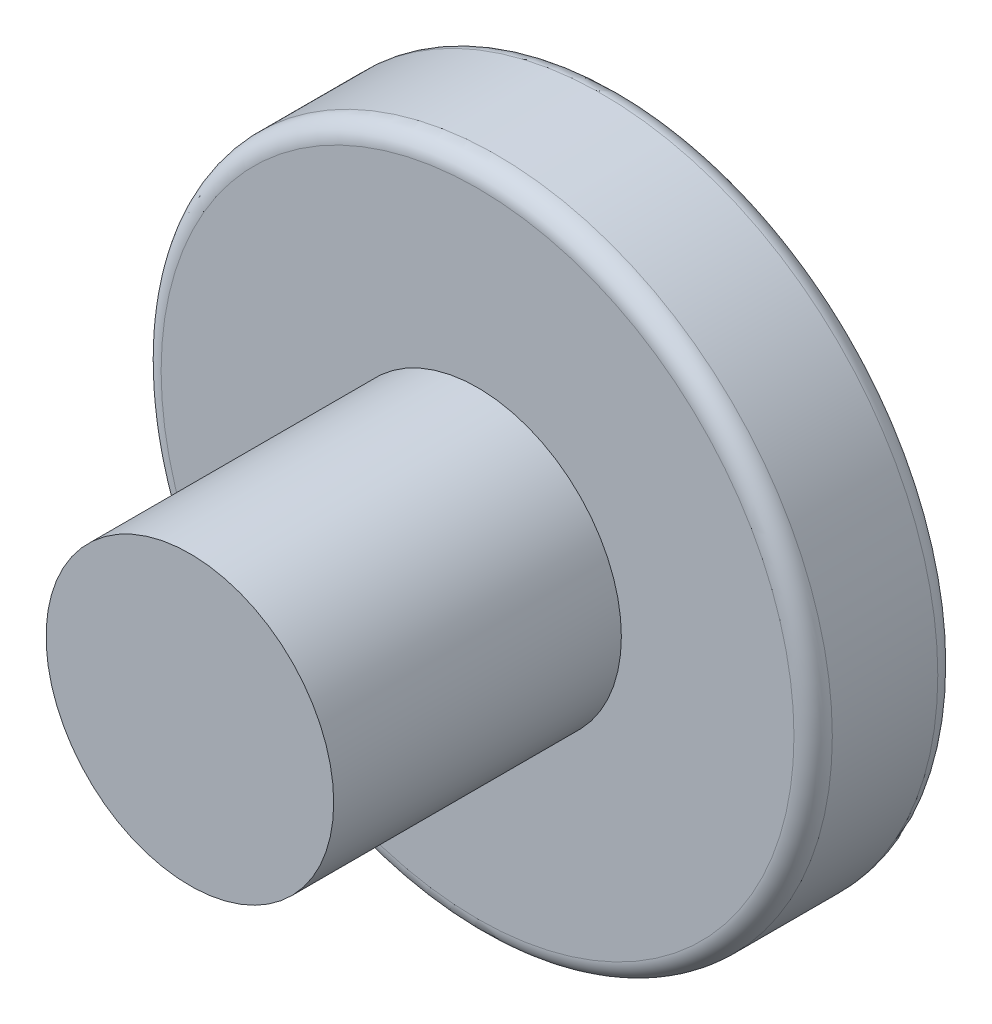
ISO-10303-21;
HEADER;
FILE_DESCRIPTION(('STEP AP214'),'2;1');
FILE_NAME('part.step','',(''),(''),'','','');
FILE_SCHEMA(('AUTOMOTIVE_DESIGN { 1 0 10303 214 1 1 1 1 }'));
ENDSEC;
DATA;
#1=APPLICATION_CONTEXT('core data for automotive mechanical design processes');
#2=APPLICATION_PROTOCOL_DEFINITION('international standard','automotive_design',2000,#1);
#3=PRODUCT_CONTEXT('',#1,'mechanical');
#4=PRODUCT('Part','Part','',(#3));
#5=PRODUCT_RELATED_PRODUCT_CATEGORY('part','',(#4));
#6=PRODUCT_DEFINITION_FORMATION('','',#4);
#7=PRODUCT_DEFINITION_CONTEXT('part definition',#1,'design');
#8=PRODUCT_DEFINITION('design','',#6,#7);
#9=PRODUCT_DEFINITION_SHAPE('','',#8);
#10=(LENGTH_UNIT() NAMED_UNIT(*) SI_UNIT(.MILLI.,.METRE.));
#11=(NAMED_UNIT(*) PLANE_ANGLE_UNIT() SI_UNIT($,.RADIAN.));
#12=(NAMED_UNIT(*) SI_UNIT($,.STERADIAN.) SOLID_ANGLE_UNIT());
#13=UNCERTAINTY_MEASURE_WITH_UNIT(LENGTH_MEASURE(1.E-05),#10,'distance_accuracy_value','');
#14=(GEOMETRIC_REPRESENTATION_CONTEXT(3) GLOBAL_UNCERTAINTY_ASSIGNED_CONTEXT((#13)) GLOBAL_UNIT_ASSIGNED_CONTEXT((#10,
#11,#12)) REPRESENTATION_CONTEXT('',''));
#15=CARTESIAN_POINT('',(0.,0.,0.));
#16=DIRECTION('',(0.,0.,1.));
#17=DIRECTION('',(1.,0.,0.));
#18=AXIS2_PLACEMENT_3D('',#15,#16,#17);
#19=CARTESIAN_POINT('',(0.,0.,1.5));
#20=DIRECTION('',(0.,0.,-1.));
#21=DIRECTION('',(-1.,0.,0.));
#22=AXIS2_PLACEMENT_3D('',#19,#20,#21);
#23=CYLINDRICAL_SURFACE('',#22,3.5);
#24=CARTESIAN_POINT('',(0.,0.,0.2));
#25=DIRECTION('',(0.,0.,1.));
#26=DIRECTION('',(1.,0.,0.));
#27=AXIS2_PLACEMENT_3D('',#24,#25,#26);
#28=CIRCLE('',#27,3.5);
#29=CARTESIAN_POINT('',(3.5,0.,0.2));
#30=VERTEX_POINT('',#29);
#31=EDGE_CURVE('E154',#30,#30,#28,.T.);
#32=ORIENTED_EDGE('',*,*,#31,.T.);
#33=EDGE_LOOP('',(#32));
#34=FACE_BOUND('',#33,.T.);
#35=CARTESIAN_POINT('',(0.,0.,1.3));
#36=DIRECTION('',(0.,0.,1.));
#37=DIRECTION('',(1.,0.,0.));
#38=AXIS2_PLACEMENT_3D('',#35,#36,#37);
#39=CIRCLE('',#38,3.5);
#40=CARTESIAN_POINT('',(3.5,0.,1.3));
#41=VERTEX_POINT('',#40);
#42=EDGE_CURVE('E151',#41,#41,#39,.F.);
#43=ORIENTED_EDGE('',*,*,#42,.T.);
#44=EDGE_LOOP('',(#43));
#45=FACE_BOUND('',#44,.T.);
#46=ADVANCED_FACE('F38',(#34,#45),#23,.T.);
#47=CARTESIAN_POINT('',(0.,0.,1.5));
#48=DIRECTION('',(0.,0.,1.));
#49=DIRECTION('',(1.,0.,0.));
#50=AXIS2_PLACEMENT_3D('',#47,#48,#49);
#51=PLANE('',#50);
#52=CARTESIAN_POINT('',(0.,0.,1.5));
#53=DIRECTION('',(0.,0.,1.));
#54=DIRECTION('',(1.,0.,0.));
#55=AXIS2_PLACEMENT_3D('',#52,#53,#54);
#56=CIRCLE('',#55,3.3);
#57=CARTESIAN_POINT('',(3.3,0.,1.5));
#58=VERTEX_POINT('',#57);
#59=EDGE_CURVE('E11',#58,#58,#56,.T.);
#60=ORIENTED_EDGE('',*,*,#59,.T.);
#61=EDGE_LOOP('',(#60));
#62=FACE_BOUND('',#61,.T.);
#63=CARTESIAN_POINT('',(0.,0.,1.5));
#64=DIRECTION('',(0.,0.,1.));
#65=DIRECTION('',(1.,0.,0.));
#66=AXIS2_PLACEMENT_3D('',#63,#64,#65);
#67=CIRCLE('',#66,1.5);
#68=CARTESIAN_POINT('',(1.5,0.,1.5));
#69=VERTEX_POINT('',#68);
#70=EDGE_CURVE('E148',#69,#69,#67,.T.);
#71=ORIENTED_EDGE('',*,*,#70,.F.);
#72=EDGE_LOOP('',(#71));
#73=FACE_BOUND('',#72,.T.);
#74=ADVANCED_FACE('F169',(#62,#73),#51,.T.);
#75=CARTESIAN_POINT('',(0.,0.,0.));
#76=DIRECTION('',(0.,0.,1.));
#77=DIRECTION('',(1.,0.,0.));
#78=AXIS2_PLACEMENT_3D('',#75,#76,#77);
#79=PLANE('',#78);
#80=DIRECTION('',(0.5,0.866025403784438,0.));
#81=VECTOR('',#80,1.);
#82=CARTESIAN_POINT('',(-1.15470053837925,0.,0.));
#83=LINE('',#82,#81);
#84=CARTESIAN_POINT('',(-1.15470053837925,0.,0.));
#85=VERTEX_POINT('',#84);
#86=CARTESIAN_POINT('',(-0.577350269189626,1.,0.));
#87=VERTEX_POINT('',#86);
#88=EDGE_CURVE('E127',#85,#87,#83,.T.);
#89=ORIENTED_EDGE('',*,*,#88,.F.);
#90=DIRECTION('',(-0.5,0.866025403784439,0.));
#91=VECTOR('',#90,1.);
#92=CARTESIAN_POINT('',(-0.577350269189626,-1.,0.));
#93=LINE('',#92,#91);
#94=CARTESIAN_POINT('',(-0.577350269189626,-1.,0.));
#95=VERTEX_POINT('',#94);
#96=EDGE_CURVE('E53',#95,#85,#93,.T.);
#97=ORIENTED_EDGE('',*,*,#96,.F.);
#98=DIRECTION('',(-1.,0.,0.));
#99=VECTOR('',#98,1.);
#100=CARTESIAN_POINT('',(0.577350269189626,-1.,0.));
#101=LINE('',#100,#99);
#102=CARTESIAN_POINT('',(0.577350269189626,-1.,0.));
#103=VERTEX_POINT('',#102);
#104=EDGE_CURVE('E136',#103,#95,#101,.T.);
#105=ORIENTED_EDGE('',*,*,#104,.F.);
#106=DIRECTION('',(-0.5,-0.866025403784438,0.));
#107=VECTOR('',#106,1.);
#108=CARTESIAN_POINT('',(1.15470053837925,0.,0.));
#109=LINE('',#108,#107);
#110=CARTESIAN_POINT('',(1.15470053837925,0.,0.));
#111=VERTEX_POINT('',#110);
#112=EDGE_CURVE('E134',#111,#103,#109,.T.);
#113=ORIENTED_EDGE('',*,*,#112,.F.);
#114=DIRECTION('',(0.5,-0.866025403784439,0.));
#115=VECTOR('',#114,1.);
#116=CARTESIAN_POINT('',(0.577350269189626,1.,0.));
#117=LINE('',#116,#115);
#118=CARTESIAN_POINT('',(0.577350269189626,1.,0.));
#119=VERTEX_POINT('',#118);
#120=EDGE_CURVE('E101',#119,#111,#117,.T.);
#121=ORIENTED_EDGE('',*,*,#120,.F.);
#122=DIRECTION('',(1.,0.,0.));
#123=VECTOR('',#122,1.);
#124=CARTESIAN_POINT('',(-0.577350269189626,1.,0.));
#125=LINE('',#124,#123);
#126=EDGE_CURVE('E130',#87,#119,#125,.T.);
#127=ORIENTED_EDGE('',*,*,#126,.F.);
#128=EDGE_LOOP('',(#89,#97,#105,#113,#121,#127));
#129=FACE_BOUND('',#128,.T.);
#130=CARTESIAN_POINT('',(0.,0.,0.));
#131=DIRECTION('',(0.,0.,1.));
#132=DIRECTION('',(1.,0.,0.));
#133=AXIS2_PLACEMENT_3D('',#130,#131,#132);
#134=CIRCLE('',#133,3.3);
#135=CARTESIAN_POINT('',(3.3,0.,0.));
#136=VERTEX_POINT('',#135);
#137=EDGE_CURVE('E46',#136,#136,#134,.F.);
#138=ORIENTED_EDGE('',*,*,#137,.T.);
#139=EDGE_LOOP('',(#138));
#140=FACE_BOUND('',#139,.T.);
#141=ADVANCED_FACE('F159',(#129,#140),#79,.F.);
#142=CARTESIAN_POINT('',(0.,0.,4.5));
#143=DIRECTION('',(0.,0.,-1.));
#144=DIRECTION('',(-1.,0.,0.));
#145=AXIS2_PLACEMENT_3D('',#142,#143,#144);
#146=CYLINDRICAL_SURFACE('',#145,1.5);
#147=CARTESIAN_POINT('',(0.,0.,4.5));
#148=DIRECTION('',(0.,0.,1.));
#149=DIRECTION('',(1.,0.,0.));
#150=AXIS2_PLACEMENT_3D('',#147,#148,#149);
#151=CIRCLE('',#150,1.5);
#152=CARTESIAN_POINT('',(1.5,0.,4.5));
#153=VERTEX_POINT('',#152);
#154=EDGE_CURVE('E140',#153,#153,#151,.T.);
#155=ORIENTED_EDGE('',*,*,#154,.F.);
#156=EDGE_LOOP('',(#155));
#157=FACE_BOUND('',#156,.T.);
#158=ORIENTED_EDGE('',*,*,#70,.T.);
#159=EDGE_LOOP('',(#158));
#160=FACE_BOUND('',#159,.T.);
#161=ADVANCED_FACE('F183',(#157,#160),#146,.T.);
#162=CARTESIAN_POINT('',(0.,0.,4.5));
#163=DIRECTION('',(0.,0.,1.));
#164=DIRECTION('',(1.,0.,0.));
#165=AXIS2_PLACEMENT_3D('',#162,#163,#164);
#166=PLANE('',#165);
#167=ORIENTED_EDGE('',*,*,#154,.T.);
#168=EDGE_LOOP('',(#167));
#169=FACE_BOUND('',#168,.T.);
#170=ADVANCED_FACE('F164',(#169),#166,.T.);
#171=CARTESIAN_POINT('',(0.,0.,0.2));
#172=DIRECTION('',(0.,0.,1.));
#173=DIRECTION('',(1.,0.,0.));
#174=AXIS2_PLACEMENT_3D('',#171,#172,#173);
#175=TOROIDAL_SURFACE('',#174,3.3,0.2);
#176=ORIENTED_EDGE('',*,*,#137,.F.);
#177=EDGE_LOOP('',(#176));
#178=FACE_BOUND('',#177,.T.);
#179=ORIENTED_EDGE('',*,*,#31,.F.);
#180=EDGE_LOOP('',(#179));
#181=FACE_BOUND('',#180,.T.);
#182=ADVANCED_FACE('F161',(#178,#181),#175,.T.);
#183=CARTESIAN_POINT('',(0.,0.,1.3));
#184=DIRECTION('',(0.,0.,1.));
#185=DIRECTION('',(1.,0.,0.));
#186=AXIS2_PLACEMENT_3D('',#183,#184,#185);
#187=TOROIDAL_SURFACE('',#186,3.3,0.2);
#188=ORIENTED_EDGE('',*,*,#42,.F.);
#189=EDGE_LOOP('',(#188));
#190=FACE_BOUND('',#189,.T.);
#191=ORIENTED_EDGE('',*,*,#59,.F.);
#192=EDGE_LOOP('',(#191));
#193=FACE_BOUND('',#192,.T.);
#194=ADVANCED_FACE('F40',(#190,#193),#187,.T.);
#195=CARTESIAN_POINT('',(-0.577350269189626,-1.,1.5));
#196=DIRECTION('',(-0.866025403784439,-0.5,0.));
#197=DIRECTION('',(0.5,-0.866025403784439,0.));
#198=AXIS2_PLACEMENT_3D('',#195,#196,#197);
#199=PLANE('',#198);
#200=ORIENTED_EDGE('',*,*,#96,.T.);
#201=DIRECTION('',(0.,0.,-1.));
#202=VECTOR('',#201,1.);
#203=CARTESIAN_POINT('',(-1.15470053837925,0.,1.5));
#204=LINE('',#203,#202);
#205=CARTESIAN_POINT('',(-1.15470053837925,0.,1.5));
#206=VERTEX_POINT('',#205);
#207=EDGE_CURVE('E83',#206,#85,#204,.T.);
#208=ORIENTED_EDGE('',*,*,#207,.F.);
#209=DIRECTION('',(-0.5,0.866025403784439,0.));
#210=VECTOR('',#209,1.);
#211=CARTESIAN_POINT('',(-0.577350269189626,-1.,1.5));
#212=LINE('',#211,#210);
#213=CARTESIAN_POINT('',(-0.577350269189626,-1.,1.5));
#214=VERTEX_POINT('',#213);
#215=EDGE_CURVE('E138',#214,#206,#212,.T.);
#216=ORIENTED_EDGE('',*,*,#215,.F.);
#217=DIRECTION('',(0.,0.,-1.));
#218=VECTOR('',#217,1.);
#219=CARTESIAN_POINT('',(-0.577350269189626,-1.,1.5));
#220=LINE('',#219,#218);
#221=EDGE_CURVE('E61',#214,#95,#220,.T.);
#222=ORIENTED_EDGE('',*,*,#221,.T.);
#223=EDGE_LOOP('',(#200,#208,#216,#222));
#224=FACE_BOUND('',#223,.T.);
#225=ADVANCED_FACE('F175',(#224),#199,.F.);
#226=CARTESIAN_POINT('',(0.577350269189626,-1.,1.5));
#227=DIRECTION('',(0.,-1.,0.));
#228=DIRECTION('',(0.,0.,-1.));
#229=AXIS2_PLACEMENT_3D('',#226,#227,#228);
#230=PLANE('',#229);
#231=ORIENTED_EDGE('',*,*,#104,.T.);
#232=ORIENTED_EDGE('',*,*,#221,.F.);
#233=DIRECTION('',(-1.,0.,0.));
#234=VECTOR('',#233,1.);
#235=CARTESIAN_POINT('',(0.577350269189626,-1.,1.5));
#236=LINE('',#235,#234);
#237=CARTESIAN_POINT('',(0.577350269189626,-1.,1.5));
#238=VERTEX_POINT('',#237);
#239=EDGE_CURVE('E113',#238,#214,#236,.T.);
#240=ORIENTED_EDGE('',*,*,#239,.F.);
#241=DIRECTION('',(0.,0.,-1.));
#242=VECTOR('',#241,1.);
#243=CARTESIAN_POINT('',(0.577350269189626,-1.,1.5));
#244=LINE('',#243,#242);
#245=EDGE_CURVE('E105',#238,#103,#244,.T.);
#246=ORIENTED_EDGE('',*,*,#245,.T.);
#247=EDGE_LOOP('',(#231,#232,#240,#246));
#248=FACE_BOUND('',#247,.T.);
#249=ADVANCED_FACE('F199',(#248),#230,.F.);
#250=CARTESIAN_POINT('',(1.15470053837925,0.,1.5));
#251=DIRECTION('',(0.866025403784439,-0.5,0.));
#252=DIRECTION('',(0.5,0.866025403784439,0.));
#253=AXIS2_PLACEMENT_3D('',#250,#251,#252);
#254=PLANE('',#253);
#255=ORIENTED_EDGE('',*,*,#112,.T.);
#256=ORIENTED_EDGE('',*,*,#245,.F.);
#257=DIRECTION('',(-0.5,-0.866025403784438,0.));
#258=VECTOR('',#257,1.);
#259=CARTESIAN_POINT('',(1.15470053837925,0.,1.5));
#260=LINE('',#259,#258);
#261=CARTESIAN_POINT('',(1.15470053837925,0.,1.5));
#262=VERTEX_POINT('',#261);
#263=EDGE_CURVE('E109',#262,#238,#260,.T.);
#264=ORIENTED_EDGE('',*,*,#263,.F.);
#265=DIRECTION('',(0.,0.,-1.));
#266=VECTOR('',#265,1.);
#267=CARTESIAN_POINT('',(1.15470053837925,0.,1.5));
#268=LINE('',#267,#266);
#269=EDGE_CURVE('E94',#262,#111,#268,.T.);
#270=ORIENTED_EDGE('',*,*,#269,.T.);
#271=EDGE_LOOP('',(#255,#256,#264,#270));
#272=FACE_BOUND('',#271,.T.);
#273=ADVANCED_FACE('F110',(#272),#254,.F.);
#274=CARTESIAN_POINT('',(0.577350269189626,1.,1.5));
#275=DIRECTION('',(0.866025403784439,0.5,0.));
#276=DIRECTION('',(-0.5,0.866025403784439,0.));
#277=AXIS2_PLACEMENT_3D('',#274,#275,#276);
#278=PLANE('',#277);
#279=ORIENTED_EDGE('',*,*,#120,.T.);
#280=ORIENTED_EDGE('',*,*,#269,.F.);
#281=DIRECTION('',(0.5,-0.866025403784439,0.));
#282=VECTOR('',#281,1.);
#283=CARTESIAN_POINT('',(0.577350269189626,1.,1.5));
#284=LINE('',#283,#282);
#285=CARTESIAN_POINT('',(0.577350269189626,1.,1.5));
#286=VERTEX_POINT('',#285);
#287=EDGE_CURVE('E98',#286,#262,#284,.T.);
#288=ORIENTED_EDGE('',*,*,#287,.F.);
#289=DIRECTION('',(0.,0.,-1.));
#290=VECTOR('',#289,1.);
#291=CARTESIAN_POINT('',(0.577350269189626,1.,1.5));
#292=LINE('',#291,#290);
#293=EDGE_CURVE('E106',#286,#119,#292,.T.);
#294=ORIENTED_EDGE('',*,*,#293,.T.);
#295=EDGE_LOOP('',(#279,#280,#288,#294));
#296=FACE_BOUND('',#295,.T.);
#297=ADVANCED_FACE('F96',(#296),#278,.F.);
#298=CARTESIAN_POINT('',(-0.577350269189626,1.,1.5));
#299=DIRECTION('',(0.,1.,0.));
#300=DIRECTION('',(0.,0.,1.));
#301=AXIS2_PLACEMENT_3D('',#298,#299,#300);
#302=PLANE('',#301);
#303=ORIENTED_EDGE('',*,*,#126,.T.);
#304=ORIENTED_EDGE('',*,*,#293,.F.);
#305=DIRECTION('',(1.,0.,0.));
#306=VECTOR('',#305,1.);
#307=CARTESIAN_POINT('',(-0.577350269189626,1.,1.5));
#308=LINE('',#307,#306);
#309=CARTESIAN_POINT('',(-0.577350269189626,1.,1.5));
#310=VERTEX_POINT('',#309);
#311=EDGE_CURVE('E119',#310,#286,#308,.T.);
#312=ORIENTED_EDGE('',*,*,#311,.F.);
#313=DIRECTION('',(0.,0.,-1.));
#314=VECTOR('',#313,1.);
#315=CARTESIAN_POINT('',(-0.577350269189626,1.,1.5));
#316=LINE('',#315,#314);
#317=EDGE_CURVE('E143',#310,#87,#316,.T.);
#318=ORIENTED_EDGE('',*,*,#317,.T.);
#319=EDGE_LOOP('',(#303,#304,#312,#318));
#320=FACE_BOUND('',#319,.T.);
#321=ADVANCED_FACE('F203',(#320),#302,.F.);
#322=CARTESIAN_POINT('',(-1.15470053837925,0.,1.5));
#323=DIRECTION('',(-0.866025403784439,0.5,0.));
#324=DIRECTION('',(-0.5,-0.866025403784439,0.));
#325=AXIS2_PLACEMENT_3D('',#322,#323,#324);
#326=PLANE('',#325);
#327=ORIENTED_EDGE('',*,*,#88,.T.);
#328=ORIENTED_EDGE('',*,*,#317,.F.);
#329=DIRECTION('',(0.5,0.866025403784438,0.));
#330=VECTOR('',#329,1.);
#331=CARTESIAN_POINT('',(-1.15470053837925,0.,1.5));
#332=LINE('',#331,#330);
#333=EDGE_CURVE('E121',#206,#310,#332,.T.);
#334=ORIENTED_EDGE('',*,*,#333,.F.);
#335=ORIENTED_EDGE('',*,*,#207,.T.);
#336=EDGE_LOOP('',(#327,#328,#334,#335));
#337=FACE_BOUND('',#336,.T.);
#338=ADVANCED_FACE('F200',(#337),#326,.F.);
#339=CARTESIAN_POINT('',(0.,0.,1.5));
#340=DIRECTION('',(0.,0.,-1.));
#341=DIRECTION('',(-1.,0.,0.));
#342=AXIS2_PLACEMENT_3D('',#339,#340,#341);
#343=PLANE('',#342);
#344=ORIENTED_EDGE('',*,*,#215,.T.);
#345=ORIENTED_EDGE('',*,*,#333,.T.);
#346=ORIENTED_EDGE('',*,*,#311,.T.);
#347=ORIENTED_EDGE('',*,*,#287,.T.);
#348=ORIENTED_EDGE('',*,*,#263,.T.);
#349=ORIENTED_EDGE('',*,*,#239,.T.);
#350=EDGE_LOOP('',(#344,#345,#346,#347,#348,#349));
#351=FACE_BOUND('',#350,.T.);
#352=ADVANCED_FACE('F116',(#351),#343,.T.);
#353=CLOSED_SHELL('',(#46,#74,#141,#161,#170,#182,#194,#225,#249,#273,#297,#321,#338,#352));
#354=MANIFOLD_SOLID_BREP('B2',#353);
#355=ADVANCED_BREP_SHAPE_REPRESENTATION('',(#18,#354),#14);
#356=SHAPE_DEFINITION_REPRESENTATION(#9,#355);
ENDSEC;
END-ISO-10303-21;
